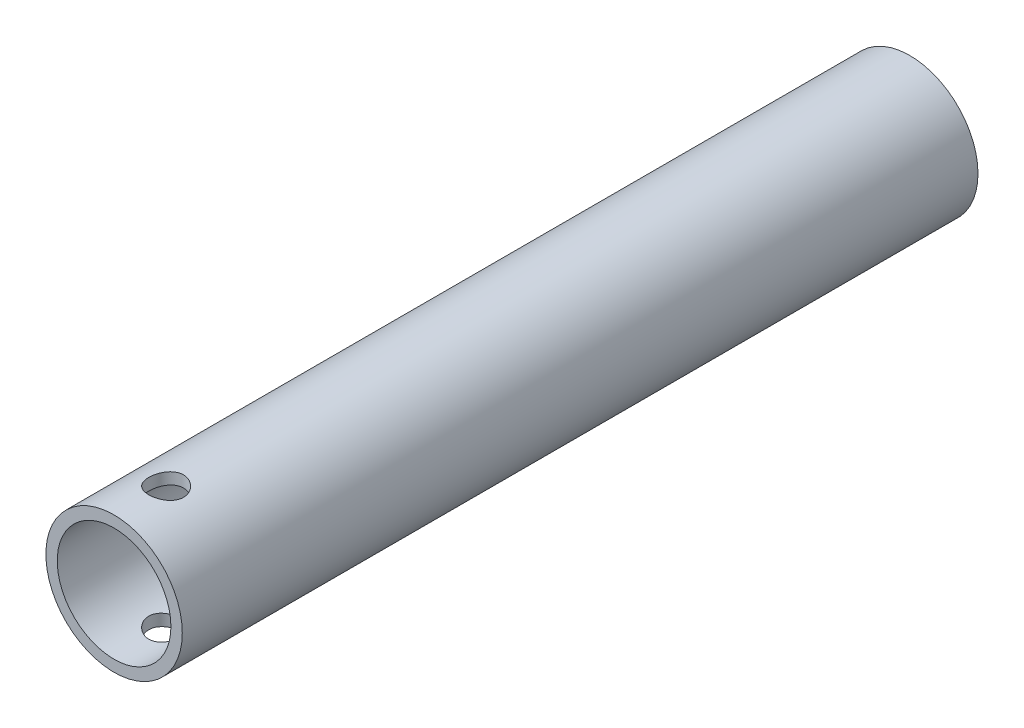
ISO-10303-21;
HEADER;
FILE_DESCRIPTION(('STEP AP214'),'2;1');
FILE_NAME('part.step','',(''),(''),'','','');
FILE_SCHEMA(('AUTOMOTIVE_DESIGN { 1 0 10303 214 1 1 1 1 }'));
ENDSEC;
DATA;
#1=APPLICATION_CONTEXT('core data for automotive mechanical design processes');
#2=APPLICATION_PROTOCOL_DEFINITION('international standard','automotive_design',2000,#1);
#3=PRODUCT_CONTEXT('',#1,'mechanical');
#4=PRODUCT('Part','Part','',(#3));
#5=PRODUCT_RELATED_PRODUCT_CATEGORY('part','',(#4));
#6=PRODUCT_DEFINITION_FORMATION('','',#4);
#7=PRODUCT_DEFINITION_CONTEXT('part definition',#1,'design');
#8=PRODUCT_DEFINITION('design','',#6,#7);
#9=PRODUCT_DEFINITION_SHAPE('','',#8);
#10=(LENGTH_UNIT() NAMED_UNIT(*) SI_UNIT(.MILLI.,.METRE.));
#11=(NAMED_UNIT(*) PLANE_ANGLE_UNIT() SI_UNIT($,.RADIAN.));
#12=(NAMED_UNIT(*) SI_UNIT($,.STERADIAN.) SOLID_ANGLE_UNIT());
#13=UNCERTAINTY_MEASURE_WITH_UNIT(LENGTH_MEASURE(1.E-05),#10,'distance_accuracy_value','');
#14=(GEOMETRIC_REPRESENTATION_CONTEXT(3) GLOBAL_UNCERTAINTY_ASSIGNED_CONTEXT((#13)) GLOBAL_UNIT_ASSIGNED_CONTEXT((#10,
#11,#12)) REPRESENTATION_CONTEXT('',''));
#15=CARTESIAN_POINT('',(0.,0.,0.));
#16=DIRECTION('',(0.,0.,1.));
#17=DIRECTION('',(1.,0.,0.));
#18=AXIS2_PLACEMENT_3D('',#15,#16,#17);
#19=CARTESIAN_POINT('',(0.,0.,152.4));
#20=DIRECTION('',(0.,0.,1.));
#21=DIRECTION('',(1.,0.,0.));
#22=AXIS2_PLACEMENT_3D('',#19,#20,#21);
#23=PLANE('',#22);
#24=CARTESIAN_POINT('',(0.,0.,152.4));
#25=DIRECTION('',(0.,0.,1.));
#26=DIRECTION('',(1.,0.,0.));
#27=AXIS2_PLACEMENT_3D('',#24,#25,#26);
#28=CIRCLE('',#27,6.);
#29=CARTESIAN_POINT('',(6.,0.,152.4));
#30=VERTEX_POINT('',#29);
#31=EDGE_CURVE('E13',#30,#30,#28,.T.);
#32=ORIENTED_EDGE('',*,*,#31,.T.);
#33=EDGE_LOOP('',(#32));
#34=FACE_BOUND('',#33,.T.);
#35=CARTESIAN_POINT('',(0.,0.,152.4));
#36=DIRECTION('',(0.,0.,1.));
#37=DIRECTION('',(1.,0.,0.));
#38=AXIS2_PLACEMENT_3D('',#35,#36,#37);
#39=CIRCLE('',#38,5.);
#40=CARTESIAN_POINT('',(5.,0.,152.4));
#41=VERTEX_POINT('',#40);
#42=EDGE_CURVE('E69',#41,#41,#39,.T.);
#43=ORIENTED_EDGE('',*,*,#42,.F.);
#44=EDGE_LOOP('',(#43));
#45=FACE_BOUND('',#44,.T.);
#46=ADVANCED_FACE('F59',(#34,#45),#23,.T.);
#47=CARTESIAN_POINT('',(0.,0.,152.4));
#48=DIRECTION('',(0.,0.,-1.));
#49=DIRECTION('',(-1.,0.,0.));
#50=AXIS2_PLACEMENT_3D('',#47,#48,#49);
#51=CYLINDRICAL_SURFACE('',#50,6.);
#52=CARTESIAN_POINT('',(0.,0.,82.4));
#53=DIRECTION('',(0.,0.,1.));
#54=DIRECTION('',(1.,0.,0.));
#55=AXIS2_PLACEMENT_3D('',#52,#53,#54);
#56=CIRCLE('',#55,6.);
#57=CARTESIAN_POINT('',(6.,0.,82.4));
#58=VERTEX_POINT('',#57);
#59=EDGE_CURVE('E113',#58,#58,#56,.F.);
#60=ORIENTED_EDGE('',*,*,#59,.F.);
#61=EDGE_LOOP('',(#60));
#62=FACE_BOUND('',#61,.T.);
#63=CARTESIAN_POINT('',(0.,-6.,149.344));
#64=CARTESIAN_POINT('',(0.0841579578397024,-5.99999860796362,149.343997719212));
#65=CARTESIAN_POINT('',(0.168341138391751,-5.99821176902423,149.337005541463));
#66=CARTESIAN_POINT('',(0.334291894498086,-5.9912569451728,149.309265245031));
#67=CARTESIAN_POINT('',(0.416058124021394,-5.98608711197333,149.288509606646));
#68=CARTESIAN_POINT('',(0.574754782380952,-5.97293834098784,149.233953540552));
#69=CARTESIAN_POINT('',(0.651690986448449,-5.96496283633373,149.200169050626));
#70=CARTESIAN_POINT('',(0.798804218444601,-5.94705058128665,149.1205710824));
#71=CARTESIAN_POINT('',(0.86898096516837,-5.93711374935153,149.074757103947));
#72=CARTESIAN_POINT('',(1.00207144963108,-5.91612060634949,148.971374516338));
#73=CARTESIAN_POINT('',(1.06482142063974,-5.90504657984812,148.91359866883));
#74=CARTESIAN_POINT('',(1.17985334115574,-5.88314391815686,148.788375922194));
#75=CARTESIAN_POINT('',(1.23213407119042,-5.87231531168399,148.720927898006));
#76=CARTESIAN_POINT('',(1.3255202757068,-5.85195033744391,148.576995470491));
#77=CARTESIAN_POINT('',(1.36644133549767,-5.84243642769314,148.500387948156));
#78=CARTESIAN_POINT('',(1.43476022008229,-5.82603690236691,148.341100231594));
#79=CARTESIAN_POINT('',(1.46216028378442,-5.81915085169359,148.258421045366));
#80=CARTESIAN_POINT('',(1.50209834099467,-5.8089689797588,148.091140814043));
#81=CARTESIAN_POINT('',(1.51493137526531,-5.80560199923866,148.006614642828));
#82=CARTESIAN_POINT('',(1.52629029532278,-5.80262658173913,147.836547241376));
#83=CARTESIAN_POINT('',(1.5248185888568,-5.80301751223506,147.751006184383));
#84=CARTESIAN_POINT('',(1.50784492934415,-5.8074498465512,147.583608122429));
#85=CARTESIAN_POINT('',(1.49269581293466,-5.81139944218728,147.501712528707));
#86=CARTESIAN_POINT('',(1.44936074333577,-5.82235761361594,147.341665089022));
#87=CARTESIAN_POINT('',(1.42117383474994,-5.82936641358185,147.263513517882));
#88=CARTESIAN_POINT('',(1.35226572824475,-5.84573671167122,147.112232650603));
#89=CARTESIAN_POINT('',(1.31141750346175,-5.85512186787008,147.039163882677));
#90=CARTESIAN_POINT('',(1.21843508146124,-5.87517420250351,146.900792029807));
#91=CARTESIAN_POINT('',(1.166298850917,-5.8858416117582,146.835490347248));
#92=CARTESIAN_POINT('',(1.05039824547901,-5.90764203229783,146.712485770319));
#93=CARTESIAN_POINT('',(0.986336457214522,-5.91877950021835,146.655063540589));
#94=CARTESIAN_POINT('',(0.849358412407124,-5.93998200115277,146.551722875352));
#95=CARTESIAN_POINT('',(0.776441868057432,-5.95004699928812,146.505804813913));
#96=CARTESIAN_POINT('',(0.623415684097729,-5.96802326629892,146.426668100875));
#97=CARTESIAN_POINT('',(0.54328084183435,-5.97592656695517,146.393496255943));
#98=CARTESIAN_POINT('',(0.378326392280433,-5.98863109771454,146.341173451748));
#99=CARTESIAN_POINT('',(0.293507714467645,-5.99343294089823,146.322019721353));
#100=CARTESIAN_POINT('',(0.123991886576104,-5.99930232578284,146.298708303699));
#101=CARTESIAN_POINT('',(0.0393504920347008,-6.00046498534282,146.294168556459));
#102=CARTESIAN_POINT('',(-0.129482992156443,-5.9991965154136,146.299164390405));
#103=CARTESIAN_POINT('',(-0.213675122912669,-5.99676572057761,146.308698660897));
#104=CARTESIAN_POINT('',(-0.377884093875578,-5.98864453995024,146.341257308822));
#105=CARTESIAN_POINT('',(-0.457945211084287,-5.98300481166997,146.364072159772));
#106=CARTESIAN_POINT('',(-0.613098871097786,-5.96910230700259,146.422304078336));
#107=CARTESIAN_POINT('',(-0.688190902005751,-5.96083926087779,146.457722441927));
#108=CARTESIAN_POINT('',(-0.832786571011266,-5.94238002846001,146.540888945351));
#109=CARTESIAN_POINT('',(-0.902163717079437,-5.93215141376421,146.588849635442));
#110=CARTESIAN_POINT('',(-1.03202037413464,-5.91094496788811,146.695468742998));
#111=CARTESIAN_POINT('',(-1.09249829391732,-5.89996700323456,146.754129069397));
#112=CARTESIAN_POINT('',(-1.20442261132458,-5.87815494940735,146.882258487411));
#113=CARTESIAN_POINT('',(-1.25560061463816,-5.86733159580688,146.951964260657));
#114=CARTESIAN_POINT('',(-1.34553404937999,-5.84736423733448,147.099198913307));
#115=CARTESIAN_POINT('',(-1.38429002734268,-5.83822015858669,147.176727448332));
#116=CARTESIAN_POINT('',(-1.44798920989089,-5.82274868085684,147.336996114704));
#117=CARTESIAN_POINT('',(-1.47301409511678,-5.81640467058189,147.419702093756));
#118=CARTESIAN_POINT('',(-1.50875142974747,-5.80723823448922,147.588334017697));
#119=CARTESIAN_POINT('',(-1.51946713047012,-5.80441500869218,147.674259226553));
#120=CARTESIAN_POINT('',(-1.5261079344663,-5.80267216432676,147.844155521427));
#121=CARTESIAN_POINT('',(-1.52246255584885,-5.80363918089764,147.928108920163));
#122=CARTESIAN_POINT('',(-1.50147082534782,-5.80910497936106,148.094161803417));
#123=CARTESIAN_POINT('',(-1.48412476621095,-5.81360368579087,148.176261327509));
#124=CARTESIAN_POINT('',(-1.43646212103035,-5.82556176291733,148.335791702777));
#125=CARTESIAN_POINT('',(-1.40622855062728,-5.83300216266747,148.413248876746));
#126=CARTESIAN_POINT('',(-1.33371442249165,-5.85000740288869,148.562047534077));
#127=CARTESIAN_POINT('',(-1.29143214097147,-5.85957254729998,148.633388140451));
#128=CARTESIAN_POINT('',(-1.19468480661547,-5.880070712982,148.769998215066));
#129=CARTESIAN_POINT('',(-1.13992286997831,-5.89103358830395,148.835052983745));
#130=CARTESIAN_POINT('',(-1.02034600549623,-5.91291652944846,148.955189418001));
#131=CARTESIAN_POINT('',(-0.955528681654008,-5.9238365844303,149.010268699821));
#132=CARTESIAN_POINT('',(-0.816205420467723,-5.94464940876753,149.109905652145));
#133=CARTESIAN_POINT('',(-0.741539798596929,-5.95451891671912,149.154245271166));
#134=CARTESIAN_POINT('',(-0.58556936767343,-5.97187120323629,149.229672598167));
#135=CARTESIAN_POINT('',(-0.504269248479534,-5.97935564973185,149.260769572183));
#136=CARTESIAN_POINT('',(-0.352624721239619,-5.9900202923965,149.304343222077));
#137=CARTESIAN_POINT('',(-0.282987255238698,-5.99373661412321,149.31918181807));
#138=CARTESIAN_POINT('',(-0.142239119375863,-5.99872695807856,149.339010775267));
#139=CARTESIAN_POINT('',(-0.0711285683345082,-6.00000117652041,149.344001927675));
#140=CARTESIAN_POINT('',(0.,-6.,149.344));
#141=B_SPLINE_CURVE_WITH_KNOTS('',3,(#63,#64,#65,#66,#67,#68,#69,#70,#71,#72,#73,#74,#75,#76,
#77,#78,#79,#80,#81,#82,#83,#84,#85,#86,#87,#88,#89,#90,#91,#92,#93,#94,#95,#96,#97,#98,#99,
#100,#101,#102,#103,#104,#105,#106,#107,#108,#109,#110,#111,#112,#113,#114,#115,#116,#117,#118,
#119,#120,#121,#122,#123,#124,#125,#126,#127,#128,#129,#130,#131,#132,#133,#134,#135,#136,#137,
#138,#139,#140),.UNSPECIFIED.,.T.,.F.,(4,2,2,2,2,2,2,2,2,2,2,2,2,2,2,2,2,2,2,2,2,2,2,2,2,2,2,2,
2,2,2,2,2,2,2,2,2,2,4),(0.,0.252213170059846,0.504564251107326,0.756607613228959,
1.00866145625712,1.26551537995255,1.52239920499156,1.78323737040666,2.04403232976794,
2.29944523473813,2.55481514983076,2.80377980189824,3.05276270073857,3.3043291652989,
3.55594098269065,3.81496813200843,4.07400370275896,4.33398161484214,4.59390812005313,
4.84698160133964,5.10003151574263,5.34919331622239,5.59838074459534,5.85210068281656,
6.10586593182849,6.3660763089748,6.62627523601863,6.88490908584576,7.14348415915604,
7.39438522367892,7.64528092726587,7.89458433028617,8.14392341862289,8.39996376821662,
8.65606522107002,8.91699719889482,9.17774629830966,9.39092879120794,9.60409415503051),.UNSPECIFIED.);
#142=CARTESIAN_POINT('',(0.,-6.,149.344));
#143=VERTEX_POINT('',#142);
#144=EDGE_CURVE('E77',#143,#143,#141,.T.);
#145=ORIENTED_EDGE('',*,*,#144,.T.);
#146=EDGE_LOOP('',(#145));
#147=FACE_BOUND('',#146,.T.);
#148=CARTESIAN_POINT('',(0.,6.,149.344));
#149=CARTESIAN_POINT('',(-0.0841579578397025,5.99999860796362,149.343997719212));
#150=CARTESIAN_POINT('',(-0.168341138391751,5.99821176902423,149.337005541463));
#151=CARTESIAN_POINT('',(-0.334291894498086,5.9912569451728,149.309265245031));
#152=CARTESIAN_POINT('',(-0.416058124021395,5.98608711197333,149.288509606646));
#153=CARTESIAN_POINT('',(-0.574754782380952,5.97293834098784,149.233953540552));
#154=CARTESIAN_POINT('',(-0.651690986448449,5.96496283633373,149.200169050626));
#155=CARTESIAN_POINT('',(-0.798804218444601,5.94705058128665,149.1205710824));
#156=CARTESIAN_POINT('',(-0.86898096516837,5.93711374935153,149.074757103947));
#157=CARTESIAN_POINT('',(-1.00207144963108,5.91612060634949,148.971374516338));
#158=CARTESIAN_POINT('',(-1.06482142063974,5.90504657984812,148.91359866883));
#159=CARTESIAN_POINT('',(-1.17985334115574,5.88314391815686,148.788375922194));
#160=CARTESIAN_POINT('',(-1.23213407119042,5.87231531168399,148.720927898006));
#161=CARTESIAN_POINT('',(-1.3255202757068,5.85195033744391,148.576995470491));
#162=CARTESIAN_POINT('',(-1.36644133549767,5.84243642769314,148.500387948156));
#163=CARTESIAN_POINT('',(-1.43476022008229,5.82603690236691,148.341100231594));
#164=CARTESIAN_POINT('',(-1.46216028378442,5.81915085169359,148.258421045366));
#165=CARTESIAN_POINT('',(-1.50209834099467,5.8089689797588,148.091140814043));
#166=CARTESIAN_POINT('',(-1.51493137526531,5.80560199923866,148.006614642828));
#167=CARTESIAN_POINT('',(-1.52629029532278,5.80262658173913,147.836547241376));
#168=CARTESIAN_POINT('',(-1.5248185888568,5.80301751223506,147.751006184383));
#169=CARTESIAN_POINT('',(-1.50784492934415,5.8074498465512,147.583608122429));
#170=CARTESIAN_POINT('',(-1.49269581293466,5.81139944218728,147.501712528707));
#171=CARTESIAN_POINT('',(-1.44936074333577,5.82235761361594,147.341665089022));
#172=CARTESIAN_POINT('',(-1.42117383474994,5.82936641358185,147.263513517882));
#173=CARTESIAN_POINT('',(-1.35226572824475,5.84573671167122,147.112232650603));
#174=CARTESIAN_POINT('',(-1.31141750346175,5.85512186787008,147.039163882677));
#175=CARTESIAN_POINT('',(-1.21843508146124,5.87517420250351,146.900792029807));
#176=CARTESIAN_POINT('',(-1.166298850917,5.8858416117582,146.835490347248));
#177=CARTESIAN_POINT('',(-1.05039824547901,5.90764203229783,146.712485770319));
#178=CARTESIAN_POINT('',(-0.986336457214522,5.91877950021835,146.655063540589));
#179=CARTESIAN_POINT('',(-0.849358412407124,5.93998200115277,146.551722875352));
#180=CARTESIAN_POINT('',(-0.776441868057432,5.95004699928812,146.505804813913));
#181=CARTESIAN_POINT('',(-0.623415684097729,5.96802326629892,146.426668100875));
#182=CARTESIAN_POINT('',(-0.54328084183435,5.97592656695517,146.393496255943));
#183=CARTESIAN_POINT('',(-0.378326392280433,5.98863109771454,146.341173451748));
#184=CARTESIAN_POINT('',(-0.293507714467645,5.99343294089823,146.322019721353));
#185=CARTESIAN_POINT('',(-0.123991886576103,5.99930232578284,146.298708303699));
#186=CARTESIAN_POINT('',(-0.0393504920347006,6.00046498534282,146.294168556459));
#187=CARTESIAN_POINT('',(0.129482992156443,5.9991965154136,146.299164390405));
#188=CARTESIAN_POINT('',(0.213675122912669,5.99676572057761,146.308698660897));
#189=CARTESIAN_POINT('',(0.377884093875578,5.98864453995024,146.341257308822));
#190=CARTESIAN_POINT('',(0.457945211084287,5.98300481166997,146.364072159772));
#191=CARTESIAN_POINT('',(0.613098871097786,5.96910230700259,146.422304078336));
#192=CARTESIAN_POINT('',(0.688190902005752,5.96083926087779,146.457722441927));
#193=CARTESIAN_POINT('',(0.832786571011266,5.94238002846001,146.540888945351));
#194=CARTESIAN_POINT('',(0.902163717079437,5.93215141376422,146.588849635442));
#195=CARTESIAN_POINT('',(1.03202037413464,5.91094496788811,146.695468742998));
#196=CARTESIAN_POINT('',(1.09249829391732,5.89996700323456,146.754129069397));
#197=CARTESIAN_POINT('',(1.20442261132458,5.87815494940735,146.882258487411));
#198=CARTESIAN_POINT('',(1.25560061463816,5.86733159580688,146.951964260657));
#199=CARTESIAN_POINT('',(1.34553404937999,5.84736423733448,147.099198913307));
#200=CARTESIAN_POINT('',(1.38429002734268,5.83822015858669,147.176727448332));
#201=CARTESIAN_POINT('',(1.44798920989089,5.82274868085684,147.336996114704));
#202=CARTESIAN_POINT('',(1.47301409511678,5.81640467058189,147.419702093756));
#203=CARTESIAN_POINT('',(1.50875142974747,5.80723823448922,147.588334017697));
#204=CARTESIAN_POINT('',(1.51946713047012,5.80441500869218,147.674259226553));
#205=CARTESIAN_POINT('',(1.5261079344663,5.80267216432676,147.844155521427));
#206=CARTESIAN_POINT('',(1.52246255584885,5.80363918089764,147.928108920163));
#207=CARTESIAN_POINT('',(1.50147082534782,5.80910497936106,148.094161803417));
#208=CARTESIAN_POINT('',(1.48412476621095,5.81360368579087,148.176261327509));
#209=CARTESIAN_POINT('',(1.43646212103035,5.82556176291733,148.335791702777));
#210=CARTESIAN_POINT('',(1.40622855062728,5.83300216266747,148.413248876746));
#211=CARTESIAN_POINT('',(1.33371442249165,5.85000740288869,148.562047534077));
#212=CARTESIAN_POINT('',(1.29143214097147,5.85957254729998,148.633388140451));
#213=CARTESIAN_POINT('',(1.19468480661547,5.880070712982,148.769998215066));
#214=CARTESIAN_POINT('',(1.13992286997831,5.89103358830395,148.835052983745));
#215=CARTESIAN_POINT('',(1.02034600549623,5.91291652944846,148.955189418001));
#216=CARTESIAN_POINT('',(0.955528681654008,5.9238365844303,149.010268699821));
#217=CARTESIAN_POINT('',(0.816205420467723,5.94464940876753,149.109905652145));
#218=CARTESIAN_POINT('',(0.741539798596929,5.95451891671912,149.154245271166));
#219=CARTESIAN_POINT('',(0.58556936767343,5.97187120323629,149.229672598167));
#220=CARTESIAN_POINT('',(0.504269248479534,5.97935564973185,149.260769572183));
#221=CARTESIAN_POINT('',(0.352624721239619,5.9900202923965,149.304343222077));
#222=CARTESIAN_POINT('',(0.282987255238699,5.99373661412321,149.31918181807));
#223=CARTESIAN_POINT('',(0.142239119375863,5.99872695807856,149.339010775267));
#224=CARTESIAN_POINT('',(0.0711285683345083,6.0000011765204,149.344001927675));
#225=CARTESIAN_POINT('',(0.,6.,149.344));
#226=B_SPLINE_CURVE_WITH_KNOTS('',3,(#148,#149,#150,#151,#152,#153,#154,#155,#156,#157,#158,
#159,#160,#161,#162,#163,#164,#165,#166,#167,#168,#169,#170,#171,#172,#173,#174,#175,#176,#177,
#178,#179,#180,#181,#182,#183,#184,#185,#186,#187,#188,#189,#190,#191,#192,#193,#194,#195,#196,
#197,#198,#199,#200,#201,#202,#203,#204,#205,#206,#207,#208,#209,#210,#211,#212,#213,#214,#215,
#216,#217,#218,#219,#220,#221,#222,#223,#224,#225),.UNSPECIFIED.,.T.,.F.,(4,2,2,2,2,2,2,2,2,2,2,
2,2,2,2,2,2,2,2,2,2,2,2,2,2,2,2,2,2,2,2,2,2,2,2,2,2,2,4),(0.,0.252213170059846,
0.504564251107326,0.756607613228959,1.00866145625712,1.26551537995255,1.52239920499156,
1.78323737040666,2.04403232976794,2.29944523473813,2.55481514983076,2.80377980189824,
3.05276270073857,3.3043291652989,3.55594098269065,3.81496813200843,4.07400370275897,
4.33398161484214,4.59390812005313,4.84698160133964,5.10003151574263,5.34919331622239,
5.59838074459534,5.85210068281656,6.10586593182849,6.3660763089748,6.62627523601863,
6.88490908584576,7.14348415915604,7.39438522367891,7.64528092726587,7.89458433028616,
8.14392341862289,8.39996376821662,8.65606522107002,8.91699719889482,9.17774629830966,
9.39092879120794,9.60409415503051),.UNSPECIFIED.);
#227=CARTESIAN_POINT('',(0.,6.,149.344));
#228=VERTEX_POINT('',#227);
#229=EDGE_CURVE('E106',#228,#228,#226,.T.);
#230=ORIENTED_EDGE('',*,*,#229,.T.);
#231=EDGE_LOOP('',(#230));
#232=FACE_BOUND('',#231,.T.);
#233=ORIENTED_EDGE('',*,*,#31,.F.);
#234=EDGE_LOOP('',(#233));
#235=FACE_BOUND('',#234,.T.);
#236=ADVANCED_FACE('F61',(#62,#147,#232,#235),#51,.T.);
#237=CARTESIAN_POINT('',(0.,0.,152.4));
#238=DIRECTION('',(0.,0.,-1.));
#239=DIRECTION('',(-1.,0.,0.));
#240=AXIS2_PLACEMENT_3D('',#237,#238,#239);
#241=CYLINDRICAL_SURFACE('',#240,5.);
#242=CARTESIAN_POINT('',(0.,0.,82.4));
#243=DIRECTION('',(0.,0.,1.));
#244=DIRECTION('',(1.,0.,0.));
#245=AXIS2_PLACEMENT_3D('',#242,#243,#244);
#246=CIRCLE('',#245,5.);
#247=CARTESIAN_POINT('',(5.,0.,82.4));
#248=VERTEX_POINT('',#247);
#249=EDGE_CURVE('E64',#248,#248,#246,.T.);
#250=ORIENTED_EDGE('',*,*,#249,.F.);
#251=EDGE_LOOP('',(#250));
#252=FACE_BOUND('',#251,.T.);
#253=CARTESIAN_POINT('',(0.,-5.,149.344));
#254=CARTESIAN_POINT('',(0.0835428795101579,-4.99999939041176,149.343999159335));
#255=CARTESIAN_POINT('',(0.167094292322951,-4.99788625578297,149.337107776155));
#256=CARTESIAN_POINT('',(0.331760104929394,-4.98966320818378,149.309792337326));
#257=CARTESIAN_POINT('',(0.412873838499691,-4.98355221279421,149.2893646167));
#258=CARTESIAN_POINT('',(0.570265651958274,-4.96800227583379,149.235724767223));
#259=CARTESIAN_POINT('',(0.646550800218087,-4.95856833803518,149.202531853666));
#260=CARTESIAN_POINT('',(0.792472638922774,-4.93735059575975,149.12438376514));
#261=CARTESIAN_POINT('',(0.862108380024698,-4.92556645648173,149.079426914039));
#262=CARTESIAN_POINT('',(0.994811804423189,-4.90051367879726,148.977628369233));
#263=CARTESIAN_POINT('',(1.057655405259,-4.88721388229812,148.920502255375));
#264=CARTESIAN_POINT('',(1.17303515006902,-4.86081256664343,148.79659274654));
#265=CARTESIAN_POINT('',(1.22556949092506,-4.84771108254241,148.729807665725));
#266=CARTESIAN_POINT('',(1.32003222005995,-4.82285836986721,148.586563329375));
#267=CARTESIAN_POINT('',(1.36168466217319,-4.8111457610427,148.509914768201));
#268=CARTESIAN_POINT('',(1.43141637665398,-4.79086374708562,148.350286276422));
#269=CARTESIAN_POINT('',(1.45949902768288,-4.7822935596686,148.267307927797));
#270=CARTESIAN_POINT('',(1.50048143754504,-4.76959189659484,148.099896324129));
#271=CARTESIAN_POINT('',(1.51379529081287,-4.76533965959341,148.015573851115));
#272=CARTESIAN_POINT('',(1.52615547788501,-4.76139636708266,147.845793097229));
#273=CARTESIAN_POINT('',(1.5252053948901,-4.76170416606009,147.760335106996));
#274=CARTESIAN_POINT('',(1.50938940910308,-4.76673930412372,147.59409843644));
#275=CARTESIAN_POINT('',(1.49504516411325,-4.77130096087592,147.513264270114));
#276=CARTESIAN_POINT('',(1.4536919889988,-4.7840613669844,147.355209189667));
#277=CARTESIAN_POINT('',(1.42668177258515,-4.79226048573751,147.277988643404));
#278=CARTESIAN_POINT('',(1.36038518100149,-4.81150220612717,147.128089498954));
#279=CARTESIAN_POINT('',(1.3209316704535,-4.82258313727474,147.055489951227));
#280=CARTESIAN_POINT('',(1.23098455976683,-4.84632184480252,146.917768450418));
#281=CARTESIAN_POINT('',(1.18048821037184,-4.85898001351801,146.852648365613));
#282=CARTESIAN_POINT('',(1.06730980197514,-4.88511612235583,146.728779186829));
#283=CARTESIAN_POINT('',(1.00419568926736,-4.89860585799219,146.670426649043));
#284=CARTESIAN_POINT('',(0.868909711518696,-4.92440163244186,146.565040099458));
#285=CARTESIAN_POINT('',(0.796737239571108,-4.93670759184493,146.518006846663));
#286=CARTESIAN_POINT('',(0.644646032330553,-4.95886790654181,146.436342655544));
#287=CARTESIAN_POINT('',(0.564675909394938,-4.96870422440098,146.401802197857));
#288=CARTESIAN_POINT('',(0.399691705480121,-4.98468691187413,146.346779619594));
#289=CARTESIAN_POINT('',(0.314679086269847,-4.99083434516949,146.326293446252));
#290=CARTESIAN_POINT('',(0.145392345445777,-4.99857726466226,146.30062697407));
#291=CARTESIAN_POINT('',(0.0612068571649568,-5.00033244340869,146.294909459159));
#292=CARTESIAN_POINT('',(-0.106927455788942,-4.99956303742859,146.297433469018));
#293=CARTESIAN_POINT('',(-0.190876311571178,-4.99703904433493,146.305673064095));
#294=CARTESIAN_POINT('',(-0.354109834618874,-4.98809958754345,146.335444173989));
#295=CARTESIAN_POINT('',(-0.433457706296287,-4.98177672753709,146.356659596183));
#296=CARTESIAN_POINT('',(-0.587448546403532,-4.96597429595501,146.411397781863));
#297=CARTESIAN_POINT('',(-0.662090941673419,-4.95649434070319,146.444922041271));
#298=CARTESIAN_POINT('',(-0.806511485869574,-4.93507833698672,146.524213932448));
#299=CARTESIAN_POINT('',(-0.87613310066029,-4.9230895651515,146.570252045932));
#300=CARTESIAN_POINT('',(-1.00684450493554,-4.89803029671913,146.672937711556));
#301=CARTESIAN_POINT('',(-1.0679320814779,-4.88495952094411,146.729588006637));
#302=CARTESIAN_POINT('',(-1.18222139662224,-4.8585929314556,146.85441517452));
#303=CARTESIAN_POINT('',(-1.23504063915925,-4.84530711251383,146.922945138516));
#304=CARTESIAN_POINT('',(-1.32845916012774,-4.82053319136545,147.068184709191));
#305=CARTESIAN_POINT('',(-1.36905871458871,-4.80904504855412,147.144894131051));
#306=CARTESIAN_POINT('',(-1.43661641336555,-4.78929788291527,147.304101566793));
#307=CARTESIAN_POINT('',(-1.46363433997094,-4.7810247457848,147.386572359902));
#308=CARTESIAN_POINT('',(-1.50331252176366,-4.76869914098489,147.555193922952));
#309=CARTESIAN_POINT('',(-1.51597790074055,-4.76464516713692,147.641343368228));
#310=CARTESIAN_POINT('',(-1.52623557586409,-4.76136855401363,147.81089379069));
#311=CARTESIAN_POINT('',(-1.52445287778174,-4.76194557291275,147.894253567829));
#312=CARTESIAN_POINT('',(-1.50736331155383,-4.76738234841674,148.059425558282));
#313=CARTESIAN_POINT('',(-1.4920570180667,-4.77224192304285,148.141237837203));
#314=CARTESIAN_POINT('',(-1.44876397248761,-4.78555971682785,148.299934438903));
#315=CARTESIAN_POINT('',(-1.42094777530003,-4.79396944305287,148.376869662625));
#316=CARTESIAN_POINT('',(-1.35355782519246,-4.81342971986145,148.525042645774));
#317=CARTESIAN_POINT('',(-1.31398176679111,-4.82448078818808,148.596279284533));
#318=CARTESIAN_POINT('',(-1.22246032854785,-4.84849517850533,148.733920325249));
#319=CARTESIAN_POINT('',(-1.17010713606845,-4.8615146252845,148.800043756233));
#320=CARTESIAN_POINT('',(-1.05524532319694,-4.8877318291436,148.922769349461));
#321=CARTESIAN_POINT('',(-0.992734037716187,-4.90092963218188,148.979369005084));
#322=CARTESIAN_POINT('',(-0.857033876980258,-4.92649945817619,149.083164612974));
#323=CARTESIAN_POINT('',(-0.783577381584346,-4.9388339926842,149.130020904185));
#324=CARTESIAN_POINT('',(-0.629453458091785,-4.96082983305627,149.210654539499));
#325=CARTESIAN_POINT('',(-0.548789220051208,-4.97049231385973,149.244437634687));
#326=CARTESIAN_POINT('',(-0.390754792185406,-4.98527605415572,149.295154485731));
#327=CARTESIAN_POINT('',(-0.313843519712526,-4.99075103445447,149.313420741321));
#328=CARTESIAN_POINT('',(-0.157957124545342,-4.99811297271642,149.337842806257));
#329=CARTESIAN_POINT('',(-0.0789823758157684,-5.00000057631156,149.344000794774));
#330=CARTESIAN_POINT('',(0.,-5.,149.344));
#331=B_SPLINE_CURVE_WITH_KNOTS('',3,(#253,#254,#255,#256,#257,#258,#259,#260,#261,#262,#263,
#264,#265,#266,#267,#268,#269,#270,#271,#272,#273,#274,#275,#276,#277,#278,#279,#280,#281,#282,
#283,#284,#285,#286,#287,#288,#289,#290,#291,#292,#293,#294,#295,#296,#297,#298,#299,#300,#301,
#302,#303,#304,#305,#306,#307,#308,#309,#310,#311,#312,#313,#314,#315,#316,#317,#318,#319,#320,
#321,#322,#323,#324,#325,#326,#327,#328,#329,#330),.UNSPECIFIED.,.T.,.F.,(4,2,2,2,2,2,2,2,2,2,2,
2,2,2,2,2,2,2,2,2,2,2,2,2,2,2,2,2,2,2,2,2,2,2,2,2,2,2,4),(0.,0.250338445007043,
0.500744697113465,0.750775481779936,1.0008419104015,1.25756255616954,1.51432806314982,
1.77708224639084,2.03977097428163,2.29489194274164,2.54994882409853,2.79546881733586,
3.04101374968599,3.29000831611775,3.53906494365568,3.79887665868416,4.05870579030267,
4.32038076750689,4.5819802550305,4.83392058652327,5.08582608790677,5.33182687069398,
5.57785756042928,5.8296994163578,6.08160645609259,6.34297763765553,6.60434291468436,
6.86454743878133,7.12465904183894,7.37358060982451,7.62249160088896,7.86810734376614,
8.11377127059126,8.36863758587443,8.62357087644972,8.88628352414554,9.14888046906536,
9.38559585077767,9.62226862601134),.UNSPECIFIED.);
#332=CARTESIAN_POINT('',(0.,-5.,149.344));
#333=VERTEX_POINT('',#332);
#334=EDGE_CURVE('E89',#333,#333,#331,.T.);
#335=ORIENTED_EDGE('',*,*,#334,.F.);
#336=EDGE_LOOP('',(#335));
#337=FACE_BOUND('',#336,.T.);
#338=CARTESIAN_POINT('',(0.,5.,149.344));
#339=CARTESIAN_POINT('',(-0.0835428795101579,4.99999939041176,149.343999159335));
#340=CARTESIAN_POINT('',(-0.167094292322951,4.99788625578297,149.337107776155));
#341=CARTESIAN_POINT('',(-0.331760104929394,4.98966320818378,149.309792337326));
#342=CARTESIAN_POINT('',(-0.412873838499692,4.98355221279421,149.2893646167));
#343=CARTESIAN_POINT('',(-0.570265651958274,4.96800227583379,149.235724767223));
#344=CARTESIAN_POINT('',(-0.646550800218087,4.95856833803518,149.202531853666));
#345=CARTESIAN_POINT('',(-0.792472638922775,4.93735059575975,149.12438376514));
#346=CARTESIAN_POINT('',(-0.862108380024698,4.92556645648173,149.079426914039));
#347=CARTESIAN_POINT('',(-0.994811804423189,4.90051367879726,148.977628369233));
#348=CARTESIAN_POINT('',(-1.057655405259,4.88721388229812,148.920502255375));
#349=CARTESIAN_POINT('',(-1.17303515006902,4.86081256664343,148.79659274654));
#350=CARTESIAN_POINT('',(-1.22556949092506,4.84771108254241,148.729807665725));
#351=CARTESIAN_POINT('',(-1.32003222005995,4.82285836986721,148.586563329375));
#352=CARTESIAN_POINT('',(-1.36168466217319,4.8111457610427,148.509914768201));
#353=CARTESIAN_POINT('',(-1.43141637665398,4.79086374708562,148.350286276422));
#354=CARTESIAN_POINT('',(-1.45949902768288,4.7822935596686,148.267307927797));
#355=CARTESIAN_POINT('',(-1.50048143754504,4.76959189659484,148.099896324129));
#356=CARTESIAN_POINT('',(-1.51379529081287,4.76533965959341,148.015573851115));
#357=CARTESIAN_POINT('',(-1.52615547788501,4.76139636708266,147.845793097229));
#358=CARTESIAN_POINT('',(-1.5252053948901,4.76170416606009,147.760335106996));
#359=CARTESIAN_POINT('',(-1.50938940910308,4.76673930412372,147.59409843644));
#360=CARTESIAN_POINT('',(-1.49504516411325,4.77130096087592,147.513264270114));
#361=CARTESIAN_POINT('',(-1.4536919889988,4.7840613669844,147.355209189667));
#362=CARTESIAN_POINT('',(-1.42668177258515,4.79226048573751,147.277988643404));
#363=CARTESIAN_POINT('',(-1.36038518100149,4.81150220612717,147.128089498954));
#364=CARTESIAN_POINT('',(-1.3209316704535,4.82258313727474,147.055489951227));
#365=CARTESIAN_POINT('',(-1.23098455976683,4.84632184480252,146.917768450418));
#366=CARTESIAN_POINT('',(-1.18048821037184,4.85898001351801,146.852648365613));
#367=CARTESIAN_POINT('',(-1.06730980197514,4.88511612235583,146.728779186829));
#368=CARTESIAN_POINT('',(-1.00419568926736,4.89860585799219,146.670426649043));
#369=CARTESIAN_POINT('',(-0.868909711518696,4.92440163244186,146.565040099458));
#370=CARTESIAN_POINT('',(-0.796737239571108,4.93670759184493,146.518006846663));
#371=CARTESIAN_POINT('',(-0.644646032330553,4.95886790654181,146.436342655544));
#372=CARTESIAN_POINT('',(-0.564675909394938,4.96870422440098,146.401802197857));
#373=CARTESIAN_POINT('',(-0.399691705480121,4.98468691187413,146.346779619594));
#374=CARTESIAN_POINT('',(-0.314679086269847,4.99083434516949,146.326293446252));
#375=CARTESIAN_POINT('',(-0.145392345445777,4.99857726466226,146.30062697407));
#376=CARTESIAN_POINT('',(-0.0612068571649572,5.00033244340869,146.294909459159));
#377=CARTESIAN_POINT('',(0.106927455788941,4.99956303742859,146.297433469018));
#378=CARTESIAN_POINT('',(0.190876311571178,4.99703904433493,146.305673064095));
#379=CARTESIAN_POINT('',(0.354109834618874,4.98809958754345,146.335444173989));
#380=CARTESIAN_POINT('',(0.433457706296286,4.98177672753709,146.356659596183));
#381=CARTESIAN_POINT('',(0.587448546403532,4.96597429595501,146.411397781863));
#382=CARTESIAN_POINT('',(0.662090941673419,4.9564943407032,146.444922041271));
#383=CARTESIAN_POINT('',(0.806511485869574,4.93507833698672,146.524213932448));
#384=CARTESIAN_POINT('',(0.87613310066029,4.9230895651515,146.570252045932));
#385=CARTESIAN_POINT('',(1.00684450493554,4.89803029671913,146.672937711556));
#386=CARTESIAN_POINT('',(1.0679320814779,4.88495952094411,146.729588006637));
#387=CARTESIAN_POINT('',(1.18222139662224,4.8585929314556,146.85441517452));
#388=CARTESIAN_POINT('',(1.23504063915925,4.84530711251383,146.922945138516));
#389=CARTESIAN_POINT('',(1.32845916012774,4.82053319136545,147.068184709191));
#390=CARTESIAN_POINT('',(1.36905871458871,4.80904504855412,147.144894131051));
#391=CARTESIAN_POINT('',(1.43661641336555,4.78929788291527,147.304101566793));
#392=CARTESIAN_POINT('',(1.46363433997094,4.7810247457848,147.386572359902));
#393=CARTESIAN_POINT('',(1.50331252176366,4.76869914098489,147.555193922952));
#394=CARTESIAN_POINT('',(1.51597790074055,4.76464516713692,147.641343368228));
#395=CARTESIAN_POINT('',(1.52623557586409,4.76136855401363,147.81089379069));
#396=CARTESIAN_POINT('',(1.52445287778174,4.76194557291275,147.894253567829));
#397=CARTESIAN_POINT('',(1.50736331155383,4.76738234841674,148.059425558282));
#398=CARTESIAN_POINT('',(1.4920570180667,4.77224192304285,148.141237837203));
#399=CARTESIAN_POINT('',(1.44876397248761,4.78555971682785,148.299934438903));
#400=CARTESIAN_POINT('',(1.42094777530003,4.79396944305287,148.376869662625));
#401=CARTESIAN_POINT('',(1.35355782519246,4.81342971986145,148.525042645774));
#402=CARTESIAN_POINT('',(1.31398176679111,4.82448078818808,148.596279284533));
#403=CARTESIAN_POINT('',(1.22246032854785,4.84849517850533,148.733920325249));
#404=CARTESIAN_POINT('',(1.17010713606844,4.8615146252845,148.800043756233));
#405=CARTESIAN_POINT('',(1.05524532319694,4.8877318291436,148.922769349461));
#406=CARTESIAN_POINT('',(0.992734037716187,4.90092963218188,148.979369005084));
#407=CARTESIAN_POINT('',(0.857033876980258,4.92649945817619,149.083164612974));
#408=CARTESIAN_POINT('',(0.783577381584345,4.9388339926842,149.130020904185));
#409=CARTESIAN_POINT('',(0.629453458091785,4.96082983305627,149.210654539499));
#410=CARTESIAN_POINT('',(0.548789220051209,4.97049231385973,149.244437634687));
#411=CARTESIAN_POINT('',(0.390754792185404,4.98527605415572,149.295154485731));
#412=CARTESIAN_POINT('',(0.31384351971252,4.99075103445447,149.313420741321));
#413=CARTESIAN_POINT('',(0.157957124545336,4.99811297271642,149.337842806257));
#414=CARTESIAN_POINT('',(0.0789823758157654,5.00000057631156,149.344000794774));
#415=CARTESIAN_POINT('',(0.,5.,149.344));
#416=B_SPLINE_CURVE_WITH_KNOTS('',3,(#338,#339,#340,#341,#342,#343,#344,#345,#346,#347,#348,
#349,#350,#351,#352,#353,#354,#355,#356,#357,#358,#359,#360,#361,#362,#363,#364,#365,#366,#367,
#368,#369,#370,#371,#372,#373,#374,#375,#376,#377,#378,#379,#380,#381,#382,#383,#384,#385,#386,
#387,#388,#389,#390,#391,#392,#393,#394,#395,#396,#397,#398,#399,#400,#401,#402,#403,#404,#405,
#406,#407,#408,#409,#410,#411,#412,#413,#414,#415),.UNSPECIFIED.,.T.,.F.,(4,2,2,2,2,2,2,2,2,2,2,
2,2,2,2,2,2,2,2,2,2,2,2,2,2,2,2,2,2,2,2,2,2,2,2,2,2,2,4),(0.,0.250338445007043,
0.500744697113465,0.750775481779937,1.0008419104015,1.25756255616954,1.51432806314982,
1.77708224639084,2.03977097428163,2.29489194274164,2.54994882409853,2.79546881733586,
3.04101374968599,3.29000831611775,3.53906494365568,3.79887665868416,4.05870579030267,
4.32038076750689,4.5819802550305,4.83392058652327,5.08582608790677,5.33182687069398,
5.57785756042928,5.8296994163578,6.08160645609259,6.34297763765553,6.60434291468436,
6.86454743878133,7.12465904183894,7.37358060982451,7.62249160088896,7.86810734376614,
8.11377127059126,8.36863758587443,8.62357087644973,8.88628352414554,9.14888046906536,
9.38559585077768,9.62226862601134),.UNSPECIFIED.);
#417=CARTESIAN_POINT('',(0.,5.,149.344));
#418=VERTEX_POINT('',#417);
#419=EDGE_CURVE('E81',#418,#418,#416,.T.);
#420=ORIENTED_EDGE('',*,*,#419,.F.);
#421=EDGE_LOOP('',(#420));
#422=FACE_BOUND('',#421,.T.);
#423=ORIENTED_EDGE('',*,*,#42,.T.);
#424=EDGE_LOOP('',(#423));
#425=FACE_BOUND('',#424,.T.);
#426=ADVANCED_FACE('F93',(#252,#337,#422,#425),#241,.F.);
#427=CARTESIAN_POINT('',(0.,-6.,147.82));
#428=DIRECTION('',(0.,1.,0.));
#429=DIRECTION('',(0.,0.,1.));
#430=AXIS2_PLACEMENT_3D('',#427,#428,#429);
#431=CYLINDRICAL_SURFACE('',#430,1.524);
#432=ORIENTED_EDGE('',*,*,#419,.T.);
#433=EDGE_LOOP('',(#432));
#434=FACE_BOUND('',#433,.T.);
#435=ORIENTED_EDGE('',*,*,#229,.F.);
#436=EDGE_LOOP('',(#435));
#437=FACE_BOUND('',#436,.T.);
#438=ADVANCED_FACE('F100',(#434,#437),#431,.F.);
#439=ORIENTED_EDGE('',*,*,#334,.T.);
#440=EDGE_LOOP('',(#439));
#441=FACE_BOUND('',#440,.T.);
#442=ORIENTED_EDGE('',*,*,#144,.F.);
#443=EDGE_LOOP('',(#442));
#444=FACE_BOUND('',#443,.T.);
#445=ADVANCED_FACE('F95',(#441,#444),#431,.F.);
#446=CARTESIAN_POINT('',(0.,0.,82.4));
#447=DIRECTION('',(0.,0.,1.));
#448=DIRECTION('',(1.,0.,0.));
#449=AXIS2_PLACEMENT_3D('',#446,#447,#448);
#450=PLANE('',#449);
#451=ORIENTED_EDGE('',*,*,#249,.T.);
#452=EDGE_LOOP('',(#451));
#453=FACE_BOUND('',#452,.T.);
#454=ORIENTED_EDGE('',*,*,#59,.T.);
#455=EDGE_LOOP('',(#454));
#456=FACE_BOUND('',#455,.T.);
#457=ADVANCED_FACE('F99',(#453,#456),#450,.F.);
#458=CLOSED_SHELL('',(#46,#236,#426,#438,#445,#457));
#459=MANIFOLD_SOLID_BREP('B2',#458);
#460=ADVANCED_BREP_SHAPE_REPRESENTATION('',(#18,#459),#14);
#461=SHAPE_DEFINITION_REPRESENTATION(#9,#460);
ENDSEC;
END-ISO-10303-21;
